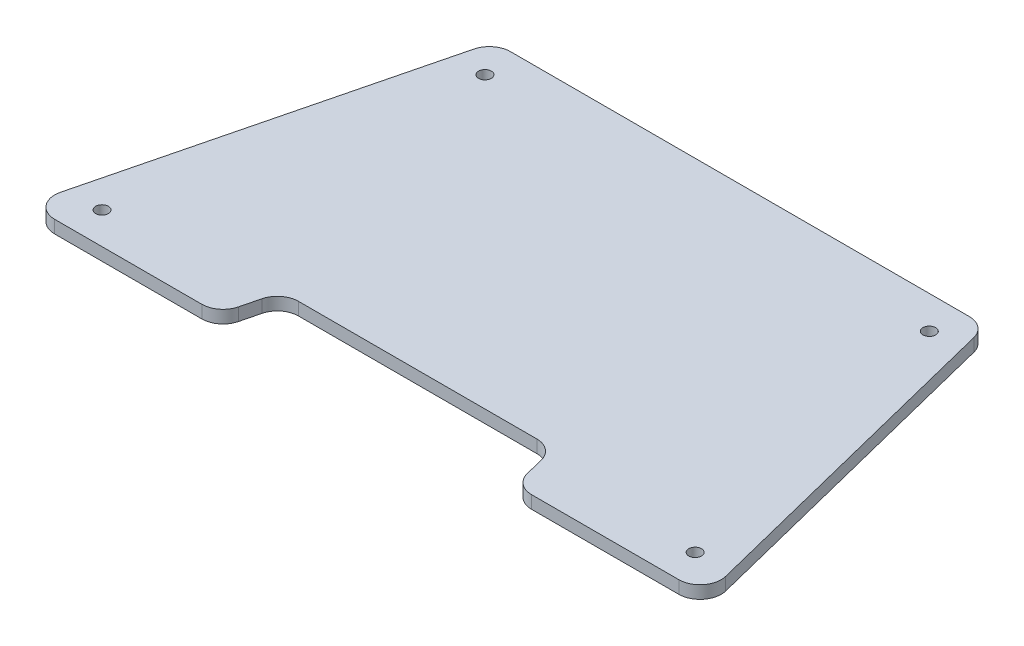
ISO-10303-21;
HEADER;
FILE_DESCRIPTION(('STEP AP214'),'2;1');
FILE_NAME('part.step','',(''),(''),'','','');
FILE_SCHEMA(('AUTOMOTIVE_DESIGN { 1 0 10303 214 1 1 1 1 }'));
ENDSEC;
DATA;
#1=APPLICATION_CONTEXT('core data for automotive mechanical design processes');
#2=APPLICATION_PROTOCOL_DEFINITION('international standard','automotive_design',2000,#1);
#3=PRODUCT_CONTEXT('',#1,'mechanical');
#4=PRODUCT('Part','Part','',(#3));
#5=PRODUCT_RELATED_PRODUCT_CATEGORY('part','',(#4));
#6=PRODUCT_DEFINITION_FORMATION('','',#4);
#7=PRODUCT_DEFINITION_CONTEXT('part definition',#1,'design');
#8=PRODUCT_DEFINITION('design','',#6,#7);
#9=PRODUCT_DEFINITION_SHAPE('','',#8);
#10=(LENGTH_UNIT() NAMED_UNIT(*) SI_UNIT(.MILLI.,.METRE.));
#11=(NAMED_UNIT(*) PLANE_ANGLE_UNIT() SI_UNIT($,.RADIAN.));
#12=(NAMED_UNIT(*) SI_UNIT($,.STERADIAN.) SOLID_ANGLE_UNIT());
#13=UNCERTAINTY_MEASURE_WITH_UNIT(LENGTH_MEASURE(1.E-05),#10,'distance_accuracy_value','');
#14=(GEOMETRIC_REPRESENTATION_CONTEXT(3) GLOBAL_UNCERTAINTY_ASSIGNED_CONTEXT((#13)) GLOBAL_UNIT_ASSIGNED_CONTEXT((#10,
#11,#12)) REPRESENTATION_CONTEXT('',''));
#15=CARTESIAN_POINT('',(0.,0.,0.));
#16=DIRECTION('',(0.,0.,1.));
#17=DIRECTION('',(1.,0.,0.));
#18=AXIS2_PLACEMENT_3D('',#15,#16,#17);
#19=CARTESIAN_POINT('',(19.0961179679779,3.,83.));
#20=DIRECTION('',(0.,-1.,0.));
#21=DIRECTION('',(0.,0.,-1.));
#22=AXIS2_PLACEMENT_3D('',#19,#20,#21);
#23=CYLINDRICAL_SURFACE('',#22,5.00000000000001);
#24=CARTESIAN_POINT('',(19.0961179679779,0.,83.));
#25=DIRECTION('',(0.,1.,0.));
#26=DIRECTION('',(0.,0.,-1.));
#27=AXIS2_PLACEMENT_3D('',#24,#25,#26);
#28=CIRCLE('',#27,5.00000000000001);
#29=CARTESIAN_POINT('',(19.0961179679779,0.,88.));
#30=VERTEX_POINT('',#29);
#31=CARTESIAN_POINT('',(23.9468304687046,0.,84.2126781251817));
#32=VERTEX_POINT('',#31);
#33=EDGE_CURVE('E180',#30,#32,#28,.T.);
#34=ORIENTED_EDGE('',*,*,#33,.T.);
#35=DIRECTION('',(0.,-1.,0.));
#36=VECTOR('',#35,1.);
#37=CARTESIAN_POINT('',(23.9468304687046,3.,84.2126781251817));
#38=LINE('',#37,#36);
#39=CARTESIAN_POINT('',(23.9468304687046,3.,84.2126781251817));
#40=VERTEX_POINT('',#39);
#41=EDGE_CURVE('E11',#40,#32,#38,.T.);
#42=ORIENTED_EDGE('',*,*,#41,.F.);
#43=CARTESIAN_POINT('',(19.0961179679779,3.,83.));
#44=DIRECTION('',(0.,1.,0.));
#45=DIRECTION('',(0.,0.,-1.));
#46=AXIS2_PLACEMENT_3D('',#43,#44,#45);
#47=CIRCLE('',#46,5.00000000000001);
#48=CARTESIAN_POINT('',(19.0961179679779,3.,88.));
#49=VERTEX_POINT('',#48);
#50=EDGE_CURVE('E211',#49,#40,#47,.T.);
#51=ORIENTED_EDGE('',*,*,#50,.F.);
#52=DIRECTION('',(0.,-1.,0.));
#53=VECTOR('',#52,1.);
#54=CARTESIAN_POINT('',(19.0961179679779,3.,88.));
#55=LINE('',#54,#53);
#56=EDGE_CURVE('E176',#49,#30,#55,.T.);
#57=ORIENTED_EDGE('',*,*,#56,.T.);
#58=EDGE_LOOP('',(#34,#42,#51,#57));
#59=FACE_BOUND('',#58,.T.);
#60=ADVANCED_FACE('F34',(#59),#23,.T.);
#61=CARTESIAN_POINT('',(25.0531695312954,3.,79.7873218748183));
#62=DIRECTION('',(-0.970142500145332,0.,-0.242535625036332));
#63=DIRECTION('',(-0.242535625036332,0.,0.970142500145332));
#64=AXIS2_PLACEMENT_3D('',#61,#62,#63);
#65=PLANE('',#64);
#66=DIRECTION('',(0.242535625036332,0.,-0.970142500145332));
#67=VECTOR('',#66,1.);
#68=CARTESIAN_POINT('',(25.0531695312954,0.,79.7873218748183));
#69=LINE('',#68,#67);
#70=CARTESIAN_POINT('',(25.0531695312954,0.,79.7873218748183));
#71=VERTEX_POINT('',#70);
#72=EDGE_CURVE('E183',#32,#71,#69,.T.);
#73=ORIENTED_EDGE('',*,*,#72,.T.);
#74=DIRECTION('',(0.,-1.,0.));
#75=VECTOR('',#74,1.);
#76=CARTESIAN_POINT('',(25.0531695312954,3.,79.7873218748183));
#77=LINE('',#76,#75);
#78=CARTESIAN_POINT('',(25.0531695312954,3.,79.7873218748183));
#79=VERTEX_POINT('',#78);
#80=EDGE_CURVE('E43',#79,#71,#77,.T.);
#81=ORIENTED_EDGE('',*,*,#80,.F.);
#82=DIRECTION('',(0.242535625036332,0.,-0.970142500145332));
#83=VECTOR('',#82,1.);
#84=CARTESIAN_POINT('',(25.0531695312954,3.,79.7873218748183));
#85=LINE('',#84,#83);
#86=EDGE_CURVE('E119',#40,#79,#85,.T.);
#87=ORIENTED_EDGE('',*,*,#86,.F.);
#88=ORIENTED_EDGE('',*,*,#41,.T.);
#89=EDGE_LOOP('',(#73,#81,#87,#88));
#90=FACE_BOUND('',#89,.T.);
#91=ADVANCED_FACE('F320',(#90),#65,.F.);
#92=CARTESIAN_POINT('',(29.9038820320221,3.,81.));
#93=DIRECTION('',(0.,-1.,0.));
#94=DIRECTION('',(0.,0.,-1.));
#95=AXIS2_PLACEMENT_3D('',#92,#93,#94);
#96=CYLINDRICAL_SURFACE('',#95,5.00000000000001);
#97=CARTESIAN_POINT('',(29.9038820320221,0.,81.));
#98=DIRECTION('',(0.,-1.,0.));
#99=DIRECTION('',(0.,0.,1.));
#100=AXIS2_PLACEMENT_3D('',#97,#98,#99);
#101=CIRCLE('',#100,5.00000000000001);
#102=CARTESIAN_POINT('',(29.9038820320221,0.,76.));
#103=VERTEX_POINT('',#102);
#104=EDGE_CURVE('E186',#71,#103,#101,.T.);
#105=ORIENTED_EDGE('',*,*,#104,.T.);
#106=DIRECTION('',(0.,-1.,0.));
#107=VECTOR('',#106,1.);
#108=CARTESIAN_POINT('',(29.9038820320221,3.,76.));
#109=LINE('',#108,#107);
#110=CARTESIAN_POINT('',(29.9038820320221,3.,76.));
#111=VERTEX_POINT('',#110);
#112=EDGE_CURVE('E242',#111,#103,#109,.T.);
#113=ORIENTED_EDGE('',*,*,#112,.F.);
#114=CARTESIAN_POINT('',(29.9038820320221,3.,81.));
#115=DIRECTION('',(0.,-1.,0.));
#116=DIRECTION('',(0.,0.,1.));
#117=AXIS2_PLACEMENT_3D('',#114,#115,#116);
#118=CIRCLE('',#117,5.00000000000001);
#119=EDGE_CURVE('E272',#79,#111,#118,.T.);
#120=ORIENTED_EDGE('',*,*,#119,.F.);
#121=ORIENTED_EDGE('',*,*,#80,.T.);
#122=EDGE_LOOP('',(#105,#113,#120,#121));
#123=FACE_BOUND('',#122,.T.);
#124=ADVANCED_FACE('F324',(#123),#96,.F.);
#125=CARTESIAN_POINT('',(86.0961179679779,3.,76.));
#126=DIRECTION('',(0.,0.,-1.));
#127=DIRECTION('',(-1.,0.,0.));
#128=AXIS2_PLACEMENT_3D('',#125,#126,#127);
#129=PLANE('',#128);
#130=DIRECTION('',(1.,0.,0.));
#131=VECTOR('',#130,1.);
#132=CARTESIAN_POINT('',(86.0961179679779,0.,76.));
#133=LINE('',#132,#131);
#134=CARTESIAN_POINT('',(86.0961179679779,0.,76.));
#135=VERTEX_POINT('',#134);
#136=EDGE_CURVE('E188',#103,#135,#133,.T.);
#137=ORIENTED_EDGE('',*,*,#136,.T.);
#138=DIRECTION('',(0.,-1.,0.));
#139=VECTOR('',#138,1.);
#140=CARTESIAN_POINT('',(86.0961179679779,3.,76.));
#141=LINE('',#140,#139);
#142=CARTESIAN_POINT('',(86.0961179679779,3.,76.));
#143=VERTEX_POINT('',#142);
#144=EDGE_CURVE('E239',#143,#135,#141,.T.);
#145=ORIENTED_EDGE('',*,*,#144,.F.);
#146=DIRECTION('',(1.,0.,0.));
#147=VECTOR('',#146,1.);
#148=CARTESIAN_POINT('',(86.0961179679779,3.,76.));
#149=LINE('',#148,#147);
#150=EDGE_CURVE('E274',#111,#143,#149,.T.);
#151=ORIENTED_EDGE('',*,*,#150,.F.);
#152=ORIENTED_EDGE('',*,*,#112,.T.);
#153=EDGE_LOOP('',(#137,#145,#151,#152));
#154=FACE_BOUND('',#153,.T.);
#155=ADVANCED_FACE('F328',(#154),#129,.F.);
#156=CARTESIAN_POINT('',(86.0961179679779,3.,81.));
#157=DIRECTION('',(0.,-1.,0.));
#158=DIRECTION('',(0.,0.,-1.));
#159=AXIS2_PLACEMENT_3D('',#156,#157,#158);
#160=CYLINDRICAL_SURFACE('',#159,5.00000000000001);
#161=CARTESIAN_POINT('',(86.0961179679779,0.,81.));
#162=DIRECTION('',(0.,-1.,0.));
#163=DIRECTION('',(0.,0.,1.));
#164=AXIS2_PLACEMENT_3D('',#161,#162,#163);
#165=CIRCLE('',#164,5.00000000000001);
#166=CARTESIAN_POINT('',(90.9468304687046,0.,79.7873218748183));
#167=VERTEX_POINT('',#166);
#168=EDGE_CURVE('E190',#135,#167,#165,.T.);
#169=ORIENTED_EDGE('',*,*,#168,.T.);
#170=DIRECTION('',(0.,-1.,0.));
#171=VECTOR('',#170,1.);
#172=CARTESIAN_POINT('',(90.9468304687046,3.,79.7873218748183));
#173=LINE('',#172,#171);
#174=CARTESIAN_POINT('',(90.9468304687046,3.,79.7873218748183));
#175=VERTEX_POINT('',#174);
#176=EDGE_CURVE('E236',#175,#167,#173,.T.);
#177=ORIENTED_EDGE('',*,*,#176,.F.);
#178=CARTESIAN_POINT('',(86.0961179679779,3.,81.));
#179=DIRECTION('',(0.,-1.,0.));
#180=DIRECTION('',(0.,0.,1.));
#181=AXIS2_PLACEMENT_3D('',#178,#179,#180);
#182=CIRCLE('',#181,5.00000000000001);
#183=EDGE_CURVE('E276',#143,#175,#182,.T.);
#184=ORIENTED_EDGE('',*,*,#183,.F.);
#185=ORIENTED_EDGE('',*,*,#144,.T.);
#186=EDGE_LOOP('',(#169,#177,#184,#185));
#187=FACE_BOUND('',#186,.T.);
#188=ADVANCED_FACE('F334',(#187),#160,.F.);
#189=CARTESIAN_POINT('',(92.0531695312954,3.,84.2126781251816));
#190=DIRECTION('',(0.970142500145332,0.,-0.242535625036331));
#191=DIRECTION('',(-0.242535625036331,0.,-0.970142500145333));
#192=AXIS2_PLACEMENT_3D('',#189,#190,#191);
#193=PLANE('',#192);
#194=DIRECTION('',(0.242535625036331,0.,0.970142500145332));
#195=VECTOR('',#194,1.);
#196=CARTESIAN_POINT('',(92.0531695312954,0.,84.2126781251816));
#197=LINE('',#196,#195);
#198=CARTESIAN_POINT('',(92.0531695312954,0.,84.2126781251816));
#199=VERTEX_POINT('',#198);
#200=EDGE_CURVE('E192',#167,#199,#197,.T.);
#201=ORIENTED_EDGE('',*,*,#200,.T.);
#202=DIRECTION('',(0.,-1.,0.));
#203=VECTOR('',#202,1.);
#204=CARTESIAN_POINT('',(92.0531695312954,3.,84.2126781251816));
#205=LINE('',#204,#203);
#206=CARTESIAN_POINT('',(92.0531695312954,3.,84.2126781251816));
#207=VERTEX_POINT('',#206);
#208=EDGE_CURVE('E233',#207,#199,#205,.T.);
#209=ORIENTED_EDGE('',*,*,#208,.F.);
#210=DIRECTION('',(0.242535625036331,0.,0.970142500145332));
#211=VECTOR('',#210,1.);
#212=CARTESIAN_POINT('',(92.0531695312954,3.,84.2126781251816));
#213=LINE('',#212,#211);
#214=EDGE_CURVE('E278',#175,#207,#213,.T.);
#215=ORIENTED_EDGE('',*,*,#214,.F.);
#216=ORIENTED_EDGE('',*,*,#176,.T.);
#217=EDGE_LOOP('',(#201,#209,#215,#216));
#218=FACE_BOUND('',#217,.T.);
#219=ADVANCED_FACE('F338',(#218),#193,.F.);
#220=CARTESIAN_POINT('',(96.9038820320221,3.,83.));
#221=DIRECTION('',(0.,-1.,0.));
#222=DIRECTION('',(0.,0.,-1.));
#223=AXIS2_PLACEMENT_3D('',#220,#221,#222);
#224=CYLINDRICAL_SURFACE('',#223,5.00000000000001);
#225=CARTESIAN_POINT('',(96.9038820320221,0.,83.));
#226=DIRECTION('',(0.,1.,0.));
#227=DIRECTION('',(0.,0.,-1.));
#228=AXIS2_PLACEMENT_3D('',#225,#226,#227);
#229=CIRCLE('',#228,5.00000000000001);
#230=CARTESIAN_POINT('',(96.9038820320221,0.,88.));
#231=VERTEX_POINT('',#230);
#232=EDGE_CURVE('E194',#199,#231,#229,.T.);
#233=ORIENTED_EDGE('',*,*,#232,.T.);
#234=DIRECTION('',(0.,-1.,0.));
#235=VECTOR('',#234,1.);
#236=CARTESIAN_POINT('',(96.9038820320221,3.,88.));
#237=LINE('',#236,#235);
#238=CARTESIAN_POINT('',(96.9038820320221,3.,88.));
#239=VERTEX_POINT('',#238);
#240=EDGE_CURVE('E230',#239,#231,#237,.T.);
#241=ORIENTED_EDGE('',*,*,#240,.F.);
#242=CARTESIAN_POINT('',(96.9038820320221,3.,83.));
#243=DIRECTION('',(0.,1.,0.));
#244=DIRECTION('',(0.,0.,-1.));
#245=AXIS2_PLACEMENT_3D('',#242,#243,#244);
#246=CIRCLE('',#245,5.00000000000001);
#247=EDGE_CURVE('E280',#207,#239,#246,.T.);
#248=ORIENTED_EDGE('',*,*,#247,.F.);
#249=ORIENTED_EDGE('',*,*,#208,.T.);
#250=EDGE_LOOP('',(#233,#241,#248,#249));
#251=FACE_BOUND('',#250,.T.);
#252=ADVANCED_FACE('F342',(#251),#224,.T.);
#253=CARTESIAN_POINT('',(131.596117967978,3.,88.));
#254=DIRECTION('',(0.,0.,-1.));
#255=DIRECTION('',(-1.,0.,0.));
#256=AXIS2_PLACEMENT_3D('',#253,#254,#255);
#257=PLANE('',#256);
#258=DIRECTION('',(1.,0.,0.));
#259=VECTOR('',#258,1.);
#260=CARTESIAN_POINT('',(131.596117967978,0.,88.));
#261=LINE('',#260,#259);
#262=CARTESIAN_POINT('',(131.596117967978,0.,88.));
#263=VERTEX_POINT('',#262);
#264=EDGE_CURVE('E196',#231,#263,#261,.T.);
#265=ORIENTED_EDGE('',*,*,#264,.T.);
#266=DIRECTION('',(0.,-1.,0.));
#267=VECTOR('',#266,1.);
#268=CARTESIAN_POINT('',(131.596117967978,3.,88.));
#269=LINE('',#268,#267);
#270=CARTESIAN_POINT('',(131.596117967978,3.,88.));
#271=VERTEX_POINT('',#270);
#272=EDGE_CURVE('E227',#271,#263,#269,.T.);
#273=ORIENTED_EDGE('',*,*,#272,.F.);
#274=DIRECTION('',(1.,0.,0.));
#275=VECTOR('',#274,1.);
#276=CARTESIAN_POINT('',(131.596117967978,3.,88.));
#277=LINE('',#276,#275);
#278=EDGE_CURVE('E282',#239,#271,#277,.T.);
#279=ORIENTED_EDGE('',*,*,#278,.F.);
#280=ORIENTED_EDGE('',*,*,#240,.T.);
#281=EDGE_LOOP('',(#265,#273,#279,#280));
#282=FACE_BOUND('',#281,.T.);
#283=ADVANCED_FACE('F346',(#282),#257,.F.);
#284=CARTESIAN_POINT('',(131.596117967978,3.,83.));
#285=DIRECTION('',(0.,-1.,0.));
#286=DIRECTION('',(0.,0.,-1.));
#287=AXIS2_PLACEMENT_3D('',#284,#285,#286);
#288=CYLINDRICAL_SURFACE('',#287,4.99999999999996);
#289=CARTESIAN_POINT('',(131.596117967978,0.,83.));
#290=DIRECTION('',(0.,1.,0.));
#291=DIRECTION('',(0.,0.,1.));
#292=AXIS2_PLACEMENT_3D('',#289,#290,#291);
#293=CIRCLE('',#292,4.99999999999996);
#294=CARTESIAN_POINT('',(136.446830468705,0.,81.7873218748183));
#295=VERTEX_POINT('',#294);
#296=EDGE_CURVE('E198',#263,#295,#293,.T.);
#297=ORIENTED_EDGE('',*,*,#296,.T.);
#298=DIRECTION('',(0.,-1.,0.));
#299=VECTOR('',#298,1.);
#300=CARTESIAN_POINT('',(136.446830468705,3.,81.7873218748183));
#301=LINE('',#300,#299);
#302=CARTESIAN_POINT('',(136.446830468705,3.,81.7873218748183));
#303=VERTEX_POINT('',#302);
#304=EDGE_CURVE('E224',#303,#295,#301,.T.);
#305=ORIENTED_EDGE('',*,*,#304,.F.);
#306=CARTESIAN_POINT('',(131.596117967978,3.,83.));
#307=DIRECTION('',(0.,1.,0.));
#308=DIRECTION('',(0.,0.,1.));
#309=AXIS2_PLACEMENT_3D('',#306,#307,#308);
#310=CIRCLE('',#309,4.99999999999996);
#311=EDGE_CURVE('E284',#271,#303,#310,.T.);
#312=ORIENTED_EDGE('',*,*,#311,.F.);
#313=ORIENTED_EDGE('',*,*,#272,.T.);
#314=EDGE_LOOP('',(#297,#305,#312,#313));
#315=FACE_BOUND('',#314,.T.);
#316=ADVANCED_FACE('F350',(#315),#288,.T.);
#317=CARTESIAN_POINT('',(116.946830468705,3.,3.78732187481833));
#318=DIRECTION('',(-0.970142500145332,0.,0.242535625036332));
#319=DIRECTION('',(0.242535625036332,0.,0.970142500145332));
#320=AXIS2_PLACEMENT_3D('',#317,#318,#319);
#321=PLANE('',#320);
#322=DIRECTION('',(-0.242535625036332,0.,-0.970142500145332));
#323=VECTOR('',#322,1.);
#324=CARTESIAN_POINT('',(116.946830468705,0.,3.78732187481833));
#325=LINE('',#324,#323);
#326=CARTESIAN_POINT('',(116.946830468705,0.,3.78732187481833));
#327=VERTEX_POINT('',#326);
#328=EDGE_CURVE('E200',#295,#327,#325,.T.);
#329=ORIENTED_EDGE('',*,*,#328,.T.);
#330=DIRECTION('',(0.,-1.,0.));
#331=VECTOR('',#330,1.);
#332=CARTESIAN_POINT('',(116.946830468705,3.,3.78732187481833));
#333=LINE('',#332,#331);
#334=CARTESIAN_POINT('',(116.946830468705,3.,3.78732187481833));
#335=VERTEX_POINT('',#334);
#336=EDGE_CURVE('E221',#335,#327,#333,.T.);
#337=ORIENTED_EDGE('',*,*,#336,.F.);
#338=DIRECTION('',(-0.242535625036332,0.,-0.970142500145332));
#339=VECTOR('',#338,1.);
#340=CARTESIAN_POINT('',(116.946830468705,3.,3.78732187481833));
#341=LINE('',#340,#339);
#342=EDGE_CURVE('E286',#303,#335,#341,.T.);
#343=ORIENTED_EDGE('',*,*,#342,.F.);
#344=ORIENTED_EDGE('',*,*,#304,.T.);
#345=EDGE_LOOP('',(#329,#337,#343,#344));
#346=FACE_BOUND('',#345,.T.);
#347=ADVANCED_FACE('F354',(#346),#321,.F.);
#348=CARTESIAN_POINT('',(112.096117967978,3.,4.99999999999999));
#349=DIRECTION('',(0.,-1.,0.));
#350=DIRECTION('',(0.,0.,-1.));
#351=AXIS2_PLACEMENT_3D('',#348,#349,#350);
#352=CYLINDRICAL_SURFACE('',#351,5.);
#353=CARTESIAN_POINT('',(112.096117967978,0.,4.99999999999999));
#354=DIRECTION('',(0.,1.,0.));
#355=DIRECTION('',(0.,0.,1.));
#356=AXIS2_PLACEMENT_3D('',#353,#354,#355);
#357=CIRCLE('',#356,5.);
#358=CARTESIAN_POINT('',(112.096117967978,0.,0.));
#359=VERTEX_POINT('',#358);
#360=EDGE_CURVE('E202',#327,#359,#357,.T.);
#361=ORIENTED_EDGE('',*,*,#360,.T.);
#362=DIRECTION('',(0.,-1.,0.));
#363=VECTOR('',#362,1.);
#364=CARTESIAN_POINT('',(112.096117967978,3.,0.));
#365=LINE('',#364,#363);
#366=CARTESIAN_POINT('',(112.096117967978,3.,0.));
#367=VERTEX_POINT('',#366);
#368=EDGE_CURVE('E218',#367,#359,#365,.T.);
#369=ORIENTED_EDGE('',*,*,#368,.F.);
#370=CARTESIAN_POINT('',(112.096117967978,3.,4.99999999999999));
#371=DIRECTION('',(0.,1.,0.));
#372=DIRECTION('',(0.,0.,1.));
#373=AXIS2_PLACEMENT_3D('',#370,#371,#372);
#374=CIRCLE('',#373,5.);
#375=EDGE_CURVE('E288',#335,#367,#374,.T.);
#376=ORIENTED_EDGE('',*,*,#375,.F.);
#377=ORIENTED_EDGE('',*,*,#336,.T.);
#378=EDGE_LOOP('',(#361,#369,#376,#377));
#379=FACE_BOUND('',#378,.T.);
#380=ADVANCED_FACE('F358',(#379),#352,.T.);
#381=CARTESIAN_POINT('',(3.90388203202207,3.,0.));
#382=DIRECTION('',(0.,0.,1.));
#383=DIRECTION('',(1.,0.,0.));
#384=AXIS2_PLACEMENT_3D('',#381,#382,#383);
#385=PLANE('',#384);
#386=DIRECTION('',(-1.,0.,0.));
#387=VECTOR('',#386,1.);
#388=CARTESIAN_POINT('',(3.90388203202207,0.,0.));
#389=LINE('',#388,#387);
#390=CARTESIAN_POINT('',(3.90388203202207,0.,0.));
#391=VERTEX_POINT('',#390);
#392=EDGE_CURVE('E204',#359,#391,#389,.T.);
#393=ORIENTED_EDGE('',*,*,#392,.T.);
#394=DIRECTION('',(0.,-1.,0.));
#395=VECTOR('',#394,1.);
#396=CARTESIAN_POINT('',(3.90388203202207,3.,0.));
#397=LINE('',#396,#395);
#398=CARTESIAN_POINT('',(3.90388203202207,3.,0.));
#399=VERTEX_POINT('',#398);
#400=EDGE_CURVE('E215',#399,#391,#397,.T.);
#401=ORIENTED_EDGE('',*,*,#400,.F.);
#402=DIRECTION('',(-1.,0.,0.));
#403=VECTOR('',#402,1.);
#404=CARTESIAN_POINT('',(3.90388203202207,3.,0.));
#405=LINE('',#404,#403);
#406=EDGE_CURVE('E290',#367,#399,#405,.T.);
#407=ORIENTED_EDGE('',*,*,#406,.F.);
#408=ORIENTED_EDGE('',*,*,#368,.T.);
#409=EDGE_LOOP('',(#393,#401,#407,#408));
#410=FACE_BOUND('',#409,.T.);
#411=ADVANCED_FACE('F296',(#410),#385,.F.);
#412=CARTESIAN_POINT('',(3.90388203202207,3.,5.));
#413=DIRECTION('',(0.,-1.,0.));
#414=DIRECTION('',(0.,0.,-1.));
#415=AXIS2_PLACEMENT_3D('',#412,#413,#414);
#416=CYLINDRICAL_SURFACE('',#415,5.);
#417=CARTESIAN_POINT('',(3.90388203202207,0.,5.));
#418=DIRECTION('',(0.,1.,0.));
#419=DIRECTION('',(0.,0.,1.));
#420=AXIS2_PLACEMENT_3D('',#417,#418,#419);
#421=CIRCLE('',#420,5.);
#422=CARTESIAN_POINT('',(-0.946830468704593,0.,3.78732187481834));
#423=VERTEX_POINT('',#422);
#424=EDGE_CURVE('E206',#391,#423,#421,.T.);
#425=ORIENTED_EDGE('',*,*,#424,.T.);
#426=DIRECTION('',(0.,-1.,0.));
#427=VECTOR('',#426,1.);
#428=CARTESIAN_POINT('',(-0.946830468704593,3.,3.78732187481834));
#429=LINE('',#428,#427);
#430=CARTESIAN_POINT('',(-0.946830468704593,3.,3.78732187481834));
#431=VERTEX_POINT('',#430);
#432=EDGE_CURVE('E171',#431,#423,#429,.T.);
#433=ORIENTED_EDGE('',*,*,#432,.F.);
#434=CARTESIAN_POINT('',(3.90388203202207,3.,5.));
#435=DIRECTION('',(0.,1.,0.));
#436=DIRECTION('',(0.,0.,1.));
#437=AXIS2_PLACEMENT_3D('',#434,#435,#436);
#438=CIRCLE('',#437,5.);
#439=EDGE_CURVE('E162',#399,#431,#438,.T.);
#440=ORIENTED_EDGE('',*,*,#439,.F.);
#441=ORIENTED_EDGE('',*,*,#400,.T.);
#442=EDGE_LOOP('',(#425,#433,#440,#441));
#443=FACE_BOUND('',#442,.T.);
#444=ADVANCED_FACE('F300',(#443),#416,.T.);
#445=CARTESIAN_POINT('',(-20.4468304687045,3.,81.7873218748183));
#446=DIRECTION('',(0.970142500145332,0.,0.242535625036332));
#447=DIRECTION('',(0.242535625036332,0.,-0.970142500145332));
#448=AXIS2_PLACEMENT_3D('',#445,#446,#447);
#449=PLANE('',#448);
#450=DIRECTION('',(-0.242535625036332,0.,0.970142500145332));
#451=VECTOR('',#450,1.);
#452=CARTESIAN_POINT('',(-20.4468304687045,0.,81.7873218748183));
#453=LINE('',#452,#451);
#454=CARTESIAN_POINT('',(-20.4468304687045,0.,81.7873218748183));
#455=VERTEX_POINT('',#454);
#456=EDGE_CURVE('E170',#423,#455,#453,.T.);
#457=ORIENTED_EDGE('',*,*,#456,.T.);
#458=DIRECTION('',(0.,-1.,0.));
#459=VECTOR('',#458,1.);
#460=CARTESIAN_POINT('',(-20.4468304687045,3.,81.7873218748183));
#461=LINE('',#460,#459);
#462=CARTESIAN_POINT('',(-20.4468304687045,3.,81.7873218748183));
#463=VERTEX_POINT('',#462);
#464=EDGE_CURVE('E167',#463,#455,#461,.T.);
#465=ORIENTED_EDGE('',*,*,#464,.F.);
#466=DIRECTION('',(-0.242535625036332,0.,0.970142500145332));
#467=VECTOR('',#466,1.);
#468=CARTESIAN_POINT('',(-20.4468304687045,3.,81.7873218748183));
#469=LINE('',#468,#467);
#470=EDGE_CURVE('E156',#431,#463,#469,.T.);
#471=ORIENTED_EDGE('',*,*,#470,.F.);
#472=ORIENTED_EDGE('',*,*,#432,.T.);
#473=EDGE_LOOP('',(#457,#465,#471,#472));
#474=FACE_BOUND('',#473,.T.);
#475=ADVANCED_FACE('F168',(#474),#449,.F.);
#476=CARTESIAN_POINT('',(-15.5961179679779,3.,83.));
#477=DIRECTION('',(0.,-1.,0.));
#478=DIRECTION('',(0.,0.,-1.));
#479=AXIS2_PLACEMENT_3D('',#476,#477,#478);
#480=CYLINDRICAL_SURFACE('',#479,4.99999999999996);
#481=CARTESIAN_POINT('',(-15.5961179679779,0.,83.));
#482=DIRECTION('',(0.,1.,0.));
#483=DIRECTION('',(0.,0.,-1.));
#484=AXIS2_PLACEMENT_3D('',#481,#482,#483);
#485=CIRCLE('',#484,4.99999999999996);
#486=CARTESIAN_POINT('',(-15.5961179679779,0.,88.));
#487=VERTEX_POINT('',#486);
#488=EDGE_CURVE('E105',#455,#487,#485,.T.);
#489=ORIENTED_EDGE('',*,*,#488,.T.);
#490=DIRECTION('',(0.,-1.,0.));
#491=VECTOR('',#490,1.);
#492=CARTESIAN_POINT('',(-15.5961179679779,3.,88.));
#493=LINE('',#492,#491);
#494=CARTESIAN_POINT('',(-15.5961179679779,3.,88.));
#495=VERTEX_POINT('',#494);
#496=EDGE_CURVE('E172',#495,#487,#493,.T.);
#497=ORIENTED_EDGE('',*,*,#496,.F.);
#498=CARTESIAN_POINT('',(-15.5961179679779,3.,83.));
#499=DIRECTION('',(0.,1.,0.));
#500=DIRECTION('',(0.,0.,-1.));
#501=AXIS2_PLACEMENT_3D('',#498,#499,#500);
#502=CIRCLE('',#501,4.99999999999996);
#503=EDGE_CURVE('E160',#463,#495,#502,.T.);
#504=ORIENTED_EDGE('',*,*,#503,.F.);
#505=ORIENTED_EDGE('',*,*,#464,.T.);
#506=EDGE_LOOP('',(#489,#497,#504,#505));
#507=FACE_BOUND('',#506,.T.);
#508=ADVANCED_FACE('F174',(#507),#480,.T.);
#509=CARTESIAN_POINT('',(19.0961179679779,3.,88.));
#510=DIRECTION('',(0.,0.,-1.));
#511=DIRECTION('',(-1.,0.,0.));
#512=AXIS2_PLACEMENT_3D('',#509,#510,#511);
#513=PLANE('',#512);
#514=DIRECTION('',(1.,0.,0.));
#515=VECTOR('',#514,1.);
#516=CARTESIAN_POINT('',(19.0961179679779,0.,88.));
#517=LINE('',#516,#515);
#518=EDGE_CURVE('E111',#487,#30,#517,.T.);
#519=ORIENTED_EDGE('',*,*,#518,.T.);
#520=ORIENTED_EDGE('',*,*,#56,.F.);
#521=DIRECTION('',(1.,0.,0.));
#522=VECTOR('',#521,1.);
#523=CARTESIAN_POINT('',(19.0961179679779,3.,88.));
#524=LINE('',#523,#522);
#525=EDGE_CURVE('E52',#495,#49,#524,.T.);
#526=ORIENTED_EDGE('',*,*,#525,.F.);
#527=ORIENTED_EDGE('',*,*,#496,.T.);
#528=EDGE_LOOP('',(#519,#520,#526,#527));
#529=FACE_BOUND('',#528,.T.);
#530=ADVANCED_FACE('F308',(#529),#513,.F.);
#531=CARTESIAN_POINT('',(19.0961179679779,3.,83.));
#532=DIRECTION('',(0.,-1.,0.));
#533=DIRECTION('',(0.,0.,-1.));
#534=AXIS2_PLACEMENT_3D('',#531,#532,#533);
#535=PLANE('',#534);
#536=CARTESIAN_POINT('',(127.94,3.,80.5));
#537=DIRECTION('',(0.,1.,0.));
#538=DIRECTION('',(0.,0.,-1.));
#539=AXIS2_PLACEMENT_3D('',#536,#537,#538);
#540=CIRCLE('',#539,1.5);
#541=CARTESIAN_POINT('',(127.94,3.,79.));
#542=VERTEX_POINT('',#541);
#543=EDGE_CURVE('E265',#542,#542,#540,.T.);
#544=ORIENTED_EDGE('',*,*,#543,.F.);
#545=EDGE_LOOP('',(#544));
#546=FACE_BOUND('',#545,.T.);
#547=CARTESIAN_POINT('',(-11.94,3.,80.5));
#548=DIRECTION('',(0.,1.,0.));
#549=DIRECTION('',(0.,0.,1.));
#550=AXIS2_PLACEMENT_3D('',#547,#548,#549);
#551=CIRCLE('',#550,1.5);
#552=CARTESIAN_POINT('',(-11.94,3.,82.));
#553=VERTEX_POINT('',#552);
#554=EDGE_CURVE('E255',#553,#553,#551,.T.);
#555=ORIENTED_EDGE('',*,*,#554,.F.);
#556=EDGE_LOOP('',(#555));
#557=FACE_BOUND('',#556,.T.);
#558=CARTESIAN_POINT('',(110.4,3.,7.73000000000001));
#559=DIRECTION('',(0.,1.,0.));
#560=DIRECTION('',(0.,0.,-1.));
#561=AXIS2_PLACEMENT_3D('',#558,#559,#560);
#562=CIRCLE('',#561,1.5);
#563=CARTESIAN_POINT('',(110.4,3.,6.23000000000001));
#564=VERTEX_POINT('',#563);
#565=EDGE_CURVE('E252',#564,#564,#562,.T.);
#566=ORIENTED_EDGE('',*,*,#565,.F.);
#567=EDGE_LOOP('',(#566));
#568=FACE_BOUND('',#567,.T.);
#569=CARTESIAN_POINT('',(5.60000000000001,3.,7.73000000000002));
#570=DIRECTION('',(0.,1.,0.));
#571=DIRECTION('',(0.,0.,1.));
#572=AXIS2_PLACEMENT_3D('',#569,#570,#571);
#573=CIRCLE('',#572,1.5);
#574=CARTESIAN_POINT('',(5.60000000000001,3.,9.23000000000002));
#575=VERTEX_POINT('',#574);
#576=EDGE_CURVE('E249',#575,#575,#573,.T.);
#577=ORIENTED_EDGE('',*,*,#576,.F.);
#578=EDGE_LOOP('',(#577));
#579=FACE_BOUND('',#578,.T.);
#580=ORIENTED_EDGE('',*,*,#50,.T.);
#581=ORIENTED_EDGE('',*,*,#86,.T.);
#582=ORIENTED_EDGE('',*,*,#119,.T.);
#583=ORIENTED_EDGE('',*,*,#150,.T.);
#584=ORIENTED_EDGE('',*,*,#183,.T.);
#585=ORIENTED_EDGE('',*,*,#214,.T.);
#586=ORIENTED_EDGE('',*,*,#247,.T.);
#587=ORIENTED_EDGE('',*,*,#278,.T.);
#588=ORIENTED_EDGE('',*,*,#311,.T.);
#589=ORIENTED_EDGE('',*,*,#342,.T.);
#590=ORIENTED_EDGE('',*,*,#375,.T.);
#591=ORIENTED_EDGE('',*,*,#406,.T.);
#592=ORIENTED_EDGE('',*,*,#439,.T.);
#593=ORIENTED_EDGE('',*,*,#470,.T.);
#594=ORIENTED_EDGE('',*,*,#503,.T.);
#595=ORIENTED_EDGE('',*,*,#525,.T.);
#596=EDGE_LOOP('',(#580,#581,#582,#583,#584,#585,#586,#587,#588,#589,#590,#591,#592,#593,#594,#595));
#597=FACE_BOUND('',#596,.T.);
#598=ADVANCED_FACE('F158',(#546,#557,#568,#579,#597),#535,.F.);
#599=CARTESIAN_POINT('',(19.0961179679779,0.,83.));
#600=DIRECTION('',(0.,-1.,0.));
#601=DIRECTION('',(0.,0.,-1.));
#602=AXIS2_PLACEMENT_3D('',#599,#600,#601);
#603=PLANE('',#602);
#604=CARTESIAN_POINT('',(127.94,0.,80.5));
#605=DIRECTION('',(0.,-1.,0.));
#606=DIRECTION('',(0.,0.,-1.));
#607=AXIS2_PLACEMENT_3D('',#604,#605,#606);
#608=CIRCLE('',#607,1.5);
#609=CARTESIAN_POINT('',(127.94,0.,79.));
#610=VERTEX_POINT('',#609);
#611=EDGE_CURVE('E37',#610,#610,#608,.T.);
#612=ORIENTED_EDGE('',*,*,#611,.F.);
#613=EDGE_LOOP('',(#612));
#614=FACE_BOUND('',#613,.T.);
#615=CARTESIAN_POINT('',(-11.94,0.,80.5));
#616=DIRECTION('',(0.,-1.,0.));
#617=DIRECTION('',(0.,0.,-1.));
#618=AXIS2_PLACEMENT_3D('',#615,#616,#617);
#619=CIRCLE('',#618,1.5);
#620=CARTESIAN_POINT('',(-11.94,0.,79.));
#621=VERTEX_POINT('',#620);
#622=EDGE_CURVE('E253',#621,#621,#619,.T.);
#623=ORIENTED_EDGE('',*,*,#622,.F.);
#624=EDGE_LOOP('',(#623));
#625=FACE_BOUND('',#624,.T.);
#626=CARTESIAN_POINT('',(110.4,0.,7.73000000000001));
#627=DIRECTION('',(0.,-1.,0.));
#628=DIRECTION('',(0.,0.,-1.));
#629=AXIS2_PLACEMENT_3D('',#626,#627,#628);
#630=CIRCLE('',#629,1.5);
#631=CARTESIAN_POINT('',(110.4,0.,6.23000000000001));
#632=VERTEX_POINT('',#631);
#633=EDGE_CURVE('E250',#632,#632,#630,.T.);
#634=ORIENTED_EDGE('',*,*,#633,.F.);
#635=EDGE_LOOP('',(#634));
#636=FACE_BOUND('',#635,.T.);
#637=CARTESIAN_POINT('',(5.60000000000001,0.,7.73000000000002));
#638=DIRECTION('',(0.,-1.,0.));
#639=DIRECTION('',(0.,0.,-1.));
#640=AXIS2_PLACEMENT_3D('',#637,#638,#639);
#641=CIRCLE('',#640,1.5);
#642=CARTESIAN_POINT('',(5.60000000000001,0.,6.23000000000002));
#643=VERTEX_POINT('',#642);
#644=EDGE_CURVE('E184',#643,#643,#641,.T.);
#645=ORIENTED_EDGE('',*,*,#644,.F.);
#646=EDGE_LOOP('',(#645));
#647=FACE_BOUND('',#646,.T.);
#648=ORIENTED_EDGE('',*,*,#33,.F.);
#649=ORIENTED_EDGE('',*,*,#518,.F.);
#650=ORIENTED_EDGE('',*,*,#488,.F.);
#651=ORIENTED_EDGE('',*,*,#456,.F.);
#652=ORIENTED_EDGE('',*,*,#424,.F.);
#653=ORIENTED_EDGE('',*,*,#392,.F.);
#654=ORIENTED_EDGE('',*,*,#360,.F.);
#655=ORIENTED_EDGE('',*,*,#328,.F.);
#656=ORIENTED_EDGE('',*,*,#296,.F.);
#657=ORIENTED_EDGE('',*,*,#264,.F.);
#658=ORIENTED_EDGE('',*,*,#232,.F.);
#659=ORIENTED_EDGE('',*,*,#200,.F.);
#660=ORIENTED_EDGE('',*,*,#168,.F.);
#661=ORIENTED_EDGE('',*,*,#136,.F.);
#662=ORIENTED_EDGE('',*,*,#104,.F.);
#663=ORIENTED_EDGE('',*,*,#72,.F.);
#664=EDGE_LOOP('',(#648,#649,#650,#651,#652,#653,#654,#655,#656,#657,#658,#659,#660,#661,#662,#663));
#665=FACE_BOUND('',#664,.T.);
#666=ADVANCED_FACE('F303',(#614,#625,#636,#647,#665),#603,.T.);
#667=CARTESIAN_POINT('',(5.60000000000001,-7.,7.73000000000002));
#668=DIRECTION('',(0.,1.,0.));
#669=DIRECTION('',(0.,0.,1.));
#670=AXIS2_PLACEMENT_3D('',#667,#668,#669);
#671=CYLINDRICAL_SURFACE('',#670,1.5);
#672=ORIENTED_EDGE('',*,*,#644,.T.);
#673=EDGE_LOOP('',(#672));
#674=FACE_BOUND('',#673,.T.);
#675=ORIENTED_EDGE('',*,*,#576,.T.);
#676=EDGE_LOOP('',(#675));
#677=FACE_BOUND('',#676,.T.);
#678=ADVANCED_FACE('F386',(#674,#677),#671,.F.);
#679=CARTESIAN_POINT('',(110.4,-7.,7.73000000000001));
#680=DIRECTION('',(0.,1.,0.));
#681=DIRECTION('',(0.,0.,1.));
#682=AXIS2_PLACEMENT_3D('',#679,#680,#681);
#683=CYLINDRICAL_SURFACE('',#682,1.5);
#684=ORIENTED_EDGE('',*,*,#633,.T.);
#685=EDGE_LOOP('',(#684));
#686=FACE_BOUND('',#685,.T.);
#687=ORIENTED_EDGE('',*,*,#565,.T.);
#688=EDGE_LOOP('',(#687));
#689=FACE_BOUND('',#688,.T.);
#690=ADVANCED_FACE('F391',(#686,#689),#683,.F.);
#691=CARTESIAN_POINT('',(-11.94,-7.,80.5));
#692=DIRECTION('',(0.,1.,0.));
#693=DIRECTION('',(0.,0.,1.));
#694=AXIS2_PLACEMENT_3D('',#691,#692,#693);
#695=CYLINDRICAL_SURFACE('',#694,1.5);
#696=ORIENTED_EDGE('',*,*,#622,.T.);
#697=EDGE_LOOP('',(#696));
#698=FACE_BOUND('',#697,.T.);
#699=ORIENTED_EDGE('',*,*,#554,.T.);
#700=EDGE_LOOP('',(#699));
#701=FACE_BOUND('',#700,.T.);
#702=ADVANCED_FACE('F403',(#698,#701),#695,.F.);
#703=CARTESIAN_POINT('',(127.94,-7.,80.5));
#704=DIRECTION('',(0.,1.,0.));
#705=DIRECTION('',(0.,0.,1.));
#706=AXIS2_PLACEMENT_3D('',#703,#704,#705);
#707=CYLINDRICAL_SURFACE('',#706,1.5);
#708=ORIENTED_EDGE('',*,*,#611,.T.);
#709=EDGE_LOOP('',(#708));
#710=FACE_BOUND('',#709,.T.);
#711=ORIENTED_EDGE('',*,*,#543,.T.);
#712=EDGE_LOOP('',(#711));
#713=FACE_BOUND('',#712,.T.);
#714=ADVANCED_FACE('F425',(#710,#713),#707,.F.);
#715=CLOSED_SHELL('',(#60,#91,#124,#155,#188,#219,#252,#283,#316,#347,#380,#411,#444,#475,#508,
#530,#598,#666,#678,#690,#702,#714));
#716=MANIFOLD_SOLID_BREP('B2',#715);
#717=ADVANCED_BREP_SHAPE_REPRESENTATION('',(#18,#716),#14);
#718=SHAPE_DEFINITION_REPRESENTATION(#9,#717);
ENDSEC;
END-ISO-10303-21;
